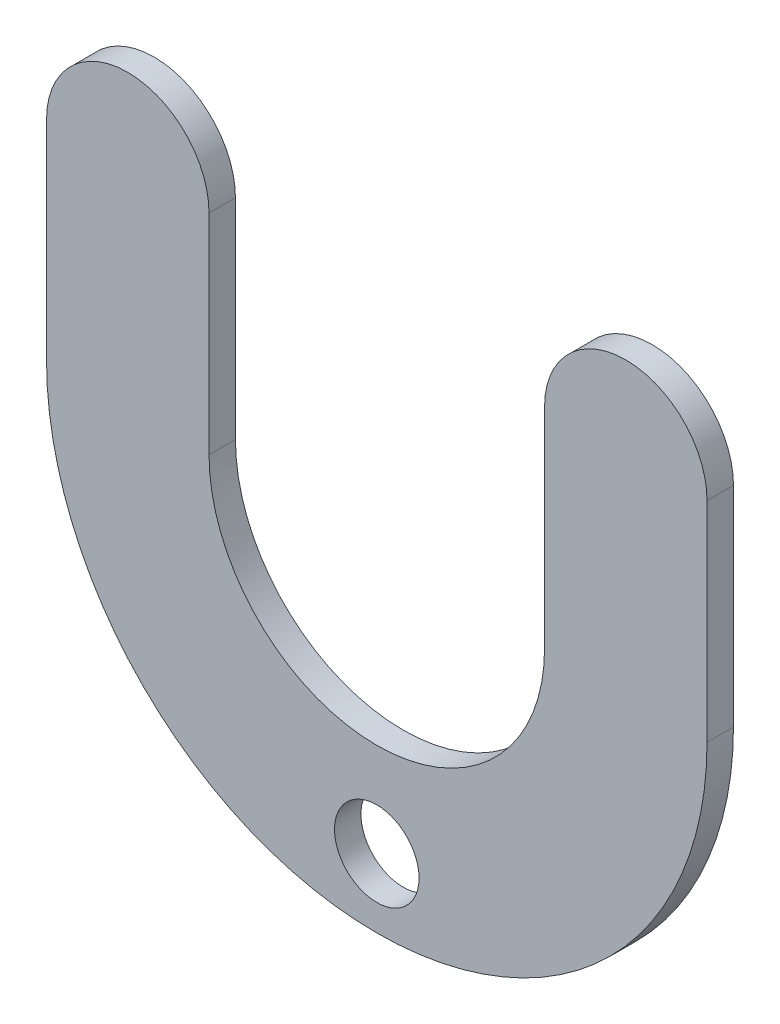
ISO-10303-21;
HEADER;
FILE_DESCRIPTION(('STEP AP214'),'2;1');
FILE_NAME('part.step','',(''),(''),'','','');
FILE_SCHEMA(('AUTOMOTIVE_DESIGN { 1 0 10303 214 1 1 1 1 }'));
ENDSEC;
DATA;
#1=APPLICATION_CONTEXT('core data for automotive mechanical design processes');
#2=APPLICATION_PROTOCOL_DEFINITION('international standard','automotive_design',2000,#1);
#3=PRODUCT_CONTEXT('',#1,'mechanical');
#4=PRODUCT('Part','Part','',(#3));
#5=PRODUCT_RELATED_PRODUCT_CATEGORY('part','',(#4));
#6=PRODUCT_DEFINITION_FORMATION('','',#4);
#7=PRODUCT_DEFINITION_CONTEXT('part definition',#1,'design');
#8=PRODUCT_DEFINITION('design','',#6,#7);
#9=PRODUCT_DEFINITION_SHAPE('','',#8);
#10=(LENGTH_UNIT() NAMED_UNIT(*) SI_UNIT(.MILLI.,.METRE.));
#11=(NAMED_UNIT(*) PLANE_ANGLE_UNIT() SI_UNIT($,.RADIAN.));
#12=(NAMED_UNIT(*) SI_UNIT($,.STERADIAN.) SOLID_ANGLE_UNIT());
#13=UNCERTAINTY_MEASURE_WITH_UNIT(LENGTH_MEASURE(1.E-05),#10,'distance_accuracy_value','');
#14=(GEOMETRIC_REPRESENTATION_CONTEXT(3) GLOBAL_UNCERTAINTY_ASSIGNED_CONTEXT((#13)) GLOBAL_UNIT_ASSIGNED_CONTEXT((#10,
#11,#12)) REPRESENTATION_CONTEXT('',''));
#15=CARTESIAN_POINT('',(0.,0.,0.));
#16=DIRECTION('',(0.,0.,1.));
#17=DIRECTION('',(1.,0.,0.));
#18=AXIS2_PLACEMENT_3D('',#15,#16,#17);
#19=CARTESIAN_POINT('',(0.,0.,-0.5));
#20=DIRECTION('',(0.,0.,1.));
#21=DIRECTION('',(1.,0.,0.));
#22=AXIS2_PLACEMENT_3D('',#19,#20,#21);
#23=PLANE('',#22);
#24=CARTESIAN_POINT('',(0.,-9.9,-0.5));
#25=DIRECTION('',(0.,0.,1.));
#26=DIRECTION('',(1.,0.,0.));
#27=AXIS2_PLACEMENT_3D('',#24,#25,#26);
#28=CIRCLE('',#27,1.6);
#29=CARTESIAN_POINT('',(1.6,-9.9,-0.5));
#30=VERTEX_POINT('',#29);
#31=EDGE_CURVE('E129',#30,#30,#28,.T.);
#32=ORIENTED_EDGE('',*,*,#31,.T.);
#33=EDGE_LOOP('',(#32));
#34=FACE_BOUND('',#33,.T.);
#35=CARTESIAN_POINT('',(0.,0.,-0.5));
#36=DIRECTION('',(0.,0.,1.));
#37=DIRECTION('',(1.,0.,0.));
#38=AXIS2_PLACEMENT_3D('',#35,#36,#37);
#39=CIRCLE('',#38,6.35);
#40=CARTESIAN_POINT('',(-6.35,0.,-0.5));
#41=VERTEX_POINT('',#40);
#42=CARTESIAN_POINT('',(6.35,0.,-0.5));
#43=VERTEX_POINT('',#42);
#44=EDGE_CURVE('E136',#41,#43,#39,.T.);
#45=ORIENTED_EDGE('',*,*,#44,.T.);
#46=DIRECTION('',(0.,1.,0.));
#47=VECTOR('',#46,1.);
#48=CARTESIAN_POINT('',(6.35,11.,-0.5));
#49=LINE('',#48,#47);
#50=CARTESIAN_POINT('',(6.35,7.925,-0.5));
#51=VERTEX_POINT('',#50);
#52=EDGE_CURVE('E112',#51,#43,#49,.F.);
#53=ORIENTED_EDGE('',*,*,#52,.F.);
#54=CARTESIAN_POINT('',(9.425,7.925,-0.5));
#55=DIRECTION('',(0.,0.,-1.));
#56=DIRECTION('',(-1.,0.,0.));
#57=AXIS2_PLACEMENT_3D('',#54,#55,#56);
#58=CIRCLE('',#57,3.075);
#59=CARTESIAN_POINT('',(12.5,7.925,-0.5));
#60=VERTEX_POINT('',#59);
#61=EDGE_CURVE('E94',#60,#51,#58,.F.);
#62=ORIENTED_EDGE('',*,*,#61,.F.);
#63=DIRECTION('',(0.,1.,0.));
#64=VECTOR('',#63,1.);
#65=CARTESIAN_POINT('',(12.5,0.,-0.5));
#66=LINE('',#65,#64);
#67=CARTESIAN_POINT('',(12.5,0.,-0.5));
#68=VERTEX_POINT('',#67);
#69=EDGE_CURVE('E92',#68,#60,#66,.T.);
#70=ORIENTED_EDGE('',*,*,#69,.F.);
#71=CARTESIAN_POINT('',(0.,0.,-0.5));
#72=DIRECTION('',(0.,0.,1.));
#73=DIRECTION('',(1.,0.,0.));
#74=AXIS2_PLACEMENT_3D('',#71,#72,#73);
#75=CIRCLE('',#74,12.5);
#76=CARTESIAN_POINT('',(-12.5,0.,-0.5));
#77=VERTEX_POINT('',#76);
#78=EDGE_CURVE('E20',#77,#68,#75,.T.);
#79=ORIENTED_EDGE('',*,*,#78,.F.);
#80=DIRECTION('',(0.,1.,0.));
#81=VECTOR('',#80,1.);
#82=CARTESIAN_POINT('',(-12.5,11.,-0.5));
#83=LINE('',#82,#81);
#84=CARTESIAN_POINT('',(-12.5,7.925,-0.5));
#85=VERTEX_POINT('',#84);
#86=EDGE_CURVE('E78',#85,#77,#83,.F.);
#87=ORIENTED_EDGE('',*,*,#86,.F.);
#88=CARTESIAN_POINT('',(-9.425,7.925,-0.5));
#89=DIRECTION('',(0.,0.,1.));
#90=DIRECTION('',(1.,0.,0.));
#91=AXIS2_PLACEMENT_3D('',#88,#89,#90);
#92=CIRCLE('',#91,3.075);
#93=CARTESIAN_POINT('',(-6.35,7.925,-0.5));
#94=VERTEX_POINT('',#93);
#95=EDGE_CURVE('E133',#94,#85,#92,.T.);
#96=ORIENTED_EDGE('',*,*,#95,.F.);
#97=DIRECTION('',(0.,1.,0.));
#98=VECTOR('',#97,1.);
#99=CARTESIAN_POINT('',(-6.35,0.,-0.5));
#100=LINE('',#99,#98);
#101=EDGE_CURVE('E109',#41,#94,#100,.T.);
#102=ORIENTED_EDGE('',*,*,#101,.F.);
#103=EDGE_LOOP('',(#45,#53,#62,#70,#79,#87,#96,#102));
#104=FACE_BOUND('',#103,.T.);
#105=ADVANCED_FACE('F17',(#34,#104),#23,.F.);
#106=CARTESIAN_POINT('',(-12.5,11.,-0.5));
#107=DIRECTION('',(-1.,0.,0.));
#108=DIRECTION('',(0.,0.,1.));
#109=AXIS2_PLACEMENT_3D('',#106,#107,#108);
#110=PLANE('',#109);
#111=DIRECTION('',(0.,1.,0.));
#112=VECTOR('',#111,1.);
#113=CARTESIAN_POINT('',(-12.5,0.,0.5));
#114=LINE('',#113,#112);
#115=CARTESIAN_POINT('',(-12.5,7.925,0.5));
#116=VERTEX_POINT('',#115);
#117=CARTESIAN_POINT('',(-12.5,0.,0.5));
#118=VERTEX_POINT('',#117);
#119=EDGE_CURVE('E128',#116,#118,#114,.F.);
#120=ORIENTED_EDGE('',*,*,#119,.F.);
#121=DIRECTION('',(0.,0.,1.));
#122=VECTOR('',#121,1.);
#123=CARTESIAN_POINT('',(-12.5,7.925,-1.8036));
#124=LINE('',#123,#122);
#125=EDGE_CURVE('E132',#85,#116,#124,.T.);
#126=ORIENTED_EDGE('',*,*,#125,.F.);
#127=ORIENTED_EDGE('',*,*,#86,.T.);
#128=DIRECTION('',(0.,0.,1.));
#129=VECTOR('',#128,1.);
#130=CARTESIAN_POINT('',(-12.5,0.,-0.5));
#131=LINE('',#130,#129);
#132=EDGE_CURVE('E89',#118,#77,#131,.F.);
#133=ORIENTED_EDGE('',*,*,#132,.F.);
#134=EDGE_LOOP('',(#120,#126,#127,#133));
#135=FACE_BOUND('',#134,.T.);
#136=ADVANCED_FACE('F192',(#135),#110,.T.);
#137=CARTESIAN_POINT('',(0.,0.,-0.5));
#138=DIRECTION('',(0.,0.,1.));
#139=DIRECTION('',(1.,0.,0.));
#140=AXIS2_PLACEMENT_3D('',#137,#138,#139);
#141=CYLINDRICAL_SURFACE('',#140,12.5);
#142=ORIENTED_EDGE('',*,*,#132,.T.);
#143=ORIENTED_EDGE('',*,*,#78,.T.);
#144=DIRECTION('',(0.,0.,-1.));
#145=VECTOR('',#144,1.);
#146=CARTESIAN_POINT('',(12.5,0.,-0.5));
#147=LINE('',#146,#145);
#148=CARTESIAN_POINT('',(12.5,0.,0.5));
#149=VERTEX_POINT('',#148);
#150=EDGE_CURVE('E87',#149,#68,#147,.T.);
#151=ORIENTED_EDGE('',*,*,#150,.F.);
#152=CARTESIAN_POINT('',(0.,0.,0.5));
#153=DIRECTION('',(0.,0.,1.));
#154=DIRECTION('',(1.,0.,0.));
#155=AXIS2_PLACEMENT_3D('',#152,#153,#154);
#156=CIRCLE('',#155,12.5);
#157=EDGE_CURVE('E126',#118,#149,#156,.T.);
#158=ORIENTED_EDGE('',*,*,#157,.F.);
#159=EDGE_LOOP('',(#142,#143,#151,#158));
#160=FACE_BOUND('',#159,.T.);
#161=ADVANCED_FACE('F84',(#160),#141,.T.);
#162=CARTESIAN_POINT('',(12.5,0.,-0.5));
#163=DIRECTION('',(1.,0.,0.));
#164=DIRECTION('',(0.,0.,-1.));
#165=AXIS2_PLACEMENT_3D('',#162,#163,#164);
#166=PLANE('',#165);
#167=ORIENTED_EDGE('',*,*,#69,.T.);
#168=DIRECTION('',(0.,0.,-1.));
#169=VECTOR('',#168,1.);
#170=CARTESIAN_POINT('',(12.5,7.925,1.8036));
#171=LINE('',#170,#169);
#172=CARTESIAN_POINT('',(12.5,7.925,0.5));
#173=VERTEX_POINT('',#172);
#174=EDGE_CURVE('E97',#173,#60,#171,.T.);
#175=ORIENTED_EDGE('',*,*,#174,.F.);
#176=DIRECTION('',(0.,1.,0.));
#177=VECTOR('',#176,1.);
#178=CARTESIAN_POINT('',(12.5,0.,0.5));
#179=LINE('',#178,#177);
#180=EDGE_CURVE('E101',#149,#173,#179,.T.);
#181=ORIENTED_EDGE('',*,*,#180,.F.);
#182=ORIENTED_EDGE('',*,*,#150,.T.);
#183=EDGE_LOOP('',(#167,#175,#181,#182));
#184=FACE_BOUND('',#183,.T.);
#185=ADVANCED_FACE('F99',(#184),#166,.T.);
#186=CARTESIAN_POINT('',(9.425,7.925,1.8036));
#187=DIRECTION('',(0.,0.,-1.));
#188=DIRECTION('',(-1.,0.,0.));
#189=AXIS2_PLACEMENT_3D('',#186,#187,#188);
#190=CYLINDRICAL_SURFACE('',#189,3.075);
#191=ORIENTED_EDGE('',*,*,#174,.T.);
#192=ORIENTED_EDGE('',*,*,#61,.T.);
#193=DIRECTION('',(0.,0.,1.));
#194=VECTOR('',#193,1.);
#195=CARTESIAN_POINT('',(6.35,7.925,-0.5));
#196=LINE('',#195,#194);
#197=CARTESIAN_POINT('',(6.35,7.925,0.5));
#198=VERTEX_POINT('',#197);
#199=EDGE_CURVE('E114',#198,#51,#196,.F.);
#200=ORIENTED_EDGE('',*,*,#199,.F.);
#201=CARTESIAN_POINT('',(9.425,7.925,0.5));
#202=DIRECTION('',(0.,0.,-1.));
#203=DIRECTION('',(-1.,0.,0.));
#204=AXIS2_PLACEMENT_3D('',#201,#202,#203);
#205=CIRCLE('',#204,3.075);
#206=EDGE_CURVE('E123',#173,#198,#205,.F.);
#207=ORIENTED_EDGE('',*,*,#206,.F.);
#208=EDGE_LOOP('',(#191,#192,#200,#207));
#209=FACE_BOUND('',#208,.T.);
#210=ADVANCED_FACE('F141',(#209),#190,.T.);
#211=CARTESIAN_POINT('',(6.35,11.,-0.5));
#212=DIRECTION('',(-1.,0.,0.));
#213=DIRECTION('',(0.,0.,1.));
#214=AXIS2_PLACEMENT_3D('',#211,#212,#213);
#215=PLANE('',#214);
#216=DIRECTION('',(0.,1.,0.));
#217=VECTOR('',#216,1.);
#218=CARTESIAN_POINT('',(6.35,0.,0.5));
#219=LINE('',#218,#217);
#220=CARTESIAN_POINT('',(6.35,0.,0.5));
#221=VERTEX_POINT('',#220);
#222=EDGE_CURVE('E122',#198,#221,#219,.F.);
#223=ORIENTED_EDGE('',*,*,#222,.F.);
#224=ORIENTED_EDGE('',*,*,#199,.T.);
#225=ORIENTED_EDGE('',*,*,#52,.T.);
#226=DIRECTION('',(0.,0.,1.));
#227=VECTOR('',#226,1.);
#228=CARTESIAN_POINT('',(6.35,0.,-0.5));
#229=LINE('',#228,#227);
#230=EDGE_CURVE('E137',#43,#221,#229,.T.);
#231=ORIENTED_EDGE('',*,*,#230,.T.);
#232=EDGE_LOOP('',(#223,#224,#225,#231));
#233=FACE_BOUND('',#232,.T.);
#234=ADVANCED_FACE('F159',(#233),#215,.T.);
#235=CARTESIAN_POINT('',(0.,0.,-0.5));
#236=DIRECTION('',(0.,0.,1.));
#237=DIRECTION('',(1.,0.,0.));
#238=AXIS2_PLACEMENT_3D('',#235,#236,#237);
#239=CYLINDRICAL_SURFACE('',#238,6.35);
#240=CARTESIAN_POINT('',(0.,0.,0.5));
#241=DIRECTION('',(0.,0.,1.));
#242=DIRECTION('',(1.,0.,0.));
#243=AXIS2_PLACEMENT_3D('',#240,#241,#242);
#244=CIRCLE('',#243,6.35);
#245=CARTESIAN_POINT('',(-6.35,0.,0.5));
#246=VERTEX_POINT('',#245);
#247=EDGE_CURVE('E119',#221,#246,#244,.F.);
#248=ORIENTED_EDGE('',*,*,#247,.F.);
#249=ORIENTED_EDGE('',*,*,#230,.F.);
#250=ORIENTED_EDGE('',*,*,#44,.F.);
#251=DIRECTION('',(0.,0.,-1.));
#252=VECTOR('',#251,1.);
#253=CARTESIAN_POINT('',(-6.35,0.,-0.5));
#254=LINE('',#253,#252);
#255=EDGE_CURVE('E111',#246,#41,#254,.T.);
#256=ORIENTED_EDGE('',*,*,#255,.F.);
#257=EDGE_LOOP('',(#248,#249,#250,#256));
#258=FACE_BOUND('',#257,.T.);
#259=ADVANCED_FACE('F163',(#258),#239,.F.);
#260=CARTESIAN_POINT('',(-6.35,0.,-0.5));
#261=DIRECTION('',(1.,0.,0.));
#262=DIRECTION('',(0.,0.,-1.));
#263=AXIS2_PLACEMENT_3D('',#260,#261,#262);
#264=PLANE('',#263);
#265=ORIENTED_EDGE('',*,*,#101,.T.);
#266=DIRECTION('',(0.,0.,1.));
#267=VECTOR('',#266,1.);
#268=CARTESIAN_POINT('',(-6.35,7.925,-1.8036));
#269=LINE('',#268,#267);
#270=CARTESIAN_POINT('',(-6.35,7.925,0.5));
#271=VERTEX_POINT('',#270);
#272=EDGE_CURVE('E35',#271,#94,#269,.F.);
#273=ORIENTED_EDGE('',*,*,#272,.F.);
#274=DIRECTION('',(0.,1.,0.));
#275=VECTOR('',#274,1.);
#276=CARTESIAN_POINT('',(-6.35,0.,0.5));
#277=LINE('',#276,#275);
#278=EDGE_CURVE('E118',#246,#271,#277,.T.);
#279=ORIENTED_EDGE('',*,*,#278,.F.);
#280=ORIENTED_EDGE('',*,*,#255,.T.);
#281=EDGE_LOOP('',(#265,#273,#279,#280));
#282=FACE_BOUND('',#281,.T.);
#283=ADVANCED_FACE('F165',(#282),#264,.T.);
#284=CARTESIAN_POINT('',(-9.425,7.925,-1.8036));
#285=DIRECTION('',(0.,0.,1.));
#286=DIRECTION('',(1.,0.,0.));
#287=AXIS2_PLACEMENT_3D('',#284,#285,#286);
#288=CYLINDRICAL_SURFACE('',#287,3.075);
#289=ORIENTED_EDGE('',*,*,#125,.T.);
#290=CARTESIAN_POINT('',(-9.425,7.925,0.5));
#291=DIRECTION('',(0.,0.,1.));
#292=DIRECTION('',(1.,0.,0.));
#293=AXIS2_PLACEMENT_3D('',#290,#291,#292);
#294=CIRCLE('',#293,3.075);
#295=EDGE_CURVE('E26',#271,#116,#294,.T.);
#296=ORIENTED_EDGE('',*,*,#295,.F.);
#297=ORIENTED_EDGE('',*,*,#272,.T.);
#298=ORIENTED_EDGE('',*,*,#95,.T.);
#299=EDGE_LOOP('',(#289,#296,#297,#298));
#300=FACE_BOUND('',#299,.T.);
#301=ADVANCED_FACE('F168',(#300),#288,.T.);
#302=CARTESIAN_POINT('',(0.,-9.9,0.5));
#303=DIRECTION('',(0.,0.,1.));
#304=DIRECTION('',(1.,0.,0.));
#305=AXIS2_PLACEMENT_3D('',#302,#303,#304);
#306=CYLINDRICAL_SURFACE('',#305,1.6);
#307=CARTESIAN_POINT('',(0.,-9.9,0.5));
#308=DIRECTION('',(0.,0.,1.));
#309=DIRECTION('',(1.,0.,0.));
#310=AXIS2_PLACEMENT_3D('',#307,#308,#309);
#311=CIRCLE('',#310,1.6);
#312=CARTESIAN_POINT('',(1.6,-9.9,0.5));
#313=VERTEX_POINT('',#312);
#314=EDGE_CURVE('E11',#313,#313,#311,.F.);
#315=ORIENTED_EDGE('',*,*,#314,.F.);
#316=EDGE_LOOP('',(#315));
#317=FACE_BOUND('',#316,.T.);
#318=ORIENTED_EDGE('',*,*,#31,.F.);
#319=EDGE_LOOP('',(#318));
#320=FACE_BOUND('',#319,.T.);
#321=ADVANCED_FACE('F175',(#317,#320),#306,.F.);
#322=CARTESIAN_POINT('',(0.,0.,0.5));
#323=DIRECTION('',(0.,0.,1.));
#324=DIRECTION('',(1.,0.,0.));
#325=AXIS2_PLACEMENT_3D('',#322,#323,#324);
#326=PLANE('',#325);
#327=ORIENTED_EDGE('',*,*,#314,.T.);
#328=EDGE_LOOP('',(#327));
#329=FACE_BOUND('',#328,.T.);
#330=ORIENTED_EDGE('',*,*,#278,.T.);
#331=ORIENTED_EDGE('',*,*,#295,.T.);
#332=ORIENTED_EDGE('',*,*,#119,.T.);
#333=ORIENTED_EDGE('',*,*,#157,.T.);
#334=ORIENTED_EDGE('',*,*,#180,.T.);
#335=ORIENTED_EDGE('',*,*,#206,.T.);
#336=ORIENTED_EDGE('',*,*,#222,.T.);
#337=ORIENTED_EDGE('',*,*,#247,.T.);
#338=EDGE_LOOP('',(#330,#331,#332,#333,#334,#335,#336,#337));
#339=FACE_BOUND('',#338,.T.);
#340=ADVANCED_FACE('F146',(#329,#339),#326,.T.);
#341=CLOSED_SHELL('',(#105,#136,#161,#185,#210,#234,#259,#283,#301,#321,#340));
#342=MANIFOLD_SOLID_BREP('B1',#341);
#343=ADVANCED_BREP_SHAPE_REPRESENTATION('',(#18,#342),#14);
#344=SHAPE_DEFINITION_REPRESENTATION(#9,#343);
ENDSEC;
END-ISO-10303-21;
